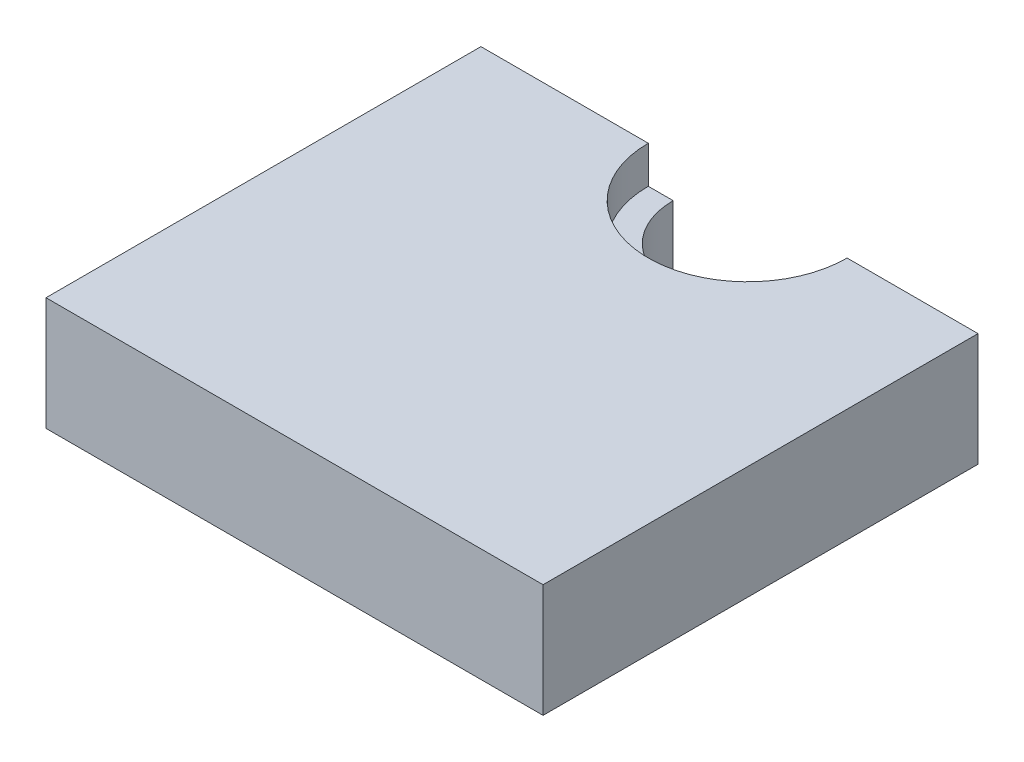
ISO-10303-21;
HEADER;
FILE_DESCRIPTION(('STEP AP214'),'2;1');
FILE_NAME('part.step','',(''),(''),'','','');
FILE_SCHEMA(('AUTOMOTIVE_DESIGN { 1 0 10303 214 1 1 1 1 }'));
ENDSEC;
DATA;
#1=APPLICATION_CONTEXT('core data for automotive mechanical design processes');
#2=APPLICATION_PROTOCOL_DEFINITION('international standard','automotive_design',2000,#1);
#3=PRODUCT_CONTEXT('',#1,'mechanical');
#4=PRODUCT('Part','Part','',(#3));
#5=PRODUCT_RELATED_PRODUCT_CATEGORY('part','',(#4));
#6=PRODUCT_DEFINITION_FORMATION('','',#4);
#7=PRODUCT_DEFINITION_CONTEXT('part definition',#1,'design');
#8=PRODUCT_DEFINITION('design','',#6,#7);
#9=PRODUCT_DEFINITION_SHAPE('','',#8);
#10=(LENGTH_UNIT() NAMED_UNIT(*) SI_UNIT(.MILLI.,.METRE.));
#11=(NAMED_UNIT(*) PLANE_ANGLE_UNIT() SI_UNIT($,.RADIAN.));
#12=(NAMED_UNIT(*) SI_UNIT($,.STERADIAN.) SOLID_ANGLE_UNIT());
#13=UNCERTAINTY_MEASURE_WITH_UNIT(LENGTH_MEASURE(1.E-05),#10,'distance_accuracy_value','');
#14=(GEOMETRIC_REPRESENTATION_CONTEXT(3) GLOBAL_UNCERTAINTY_ASSIGNED_CONTEXT((#13)) GLOBAL_UNIT_ASSIGNED_CONTEXT((#10,
#11,#12)) REPRESENTATION_CONTEXT('',''));
#15=CARTESIAN_POINT('',(0.,0.,0.));
#16=DIRECTION('',(0.,0.,1.));
#17=DIRECTION('',(1.,0.,0.));
#18=AXIS2_PLACEMENT_3D('',#15,#16,#17);
#19=CARTESIAN_POINT('',(0.,0.,0.));
#20=DIRECTION('',(0.,0.,-1.));
#21=DIRECTION('',(-1.,0.,0.));
#22=AXIS2_PLACEMENT_3D('',#19,#20,#21);
#23=PLANE('',#22);
#24=DIRECTION('',(0.,-1.,0.));
#25=VECTOR('',#24,1.);
#26=CARTESIAN_POINT('',(9.46778918948752,-9.28940992353105,0.));
#27=LINE('',#26,#25);
#28=CARTESIAN_POINT('',(9.46778918948752,-3.99999999999999,0.));
#29=VERTEX_POINT('',#28);
#30=CARTESIAN_POINT('',(9.46778918948752,-4.10806391469265,0.));
#31=VERTEX_POINT('',#30);
#32=EDGE_CURVE('E140',#29,#31,#27,.T.);
#33=ORIENTED_EDGE('',*,*,#32,.F.);
#34=DIRECTION('',(1.,0.,0.));
#35=VECTOR('',#34,1.);
#36=CARTESIAN_POINT('',(0.,-3.99999999999999,0.));
#37=LINE('',#36,#35);
#38=CARTESIAN_POINT('',(7.46778918948752,-3.99999999999999,0.));
#39=VERTEX_POINT('',#38);
#40=EDGE_CURVE('E151',#39,#29,#37,.T.);
#41=ORIENTED_EDGE('',*,*,#40,.F.);
#42=DIRECTION('',(0.,-1.,0.));
#43=VECTOR('',#42,1.);
#44=CARTESIAN_POINT('',(7.46778918948752,-9.28940992353105,0.));
#45=LINE('',#44,#43);
#46=CARTESIAN_POINT('',(7.46778918948752,2.00000000000001,0.));
#47=VERTEX_POINT('',#46);
#48=EDGE_CURVE('E150',#47,#39,#45,.T.);
#49=ORIENTED_EDGE('',*,*,#48,.F.);
#50=DIRECTION('',(-1.,0.,0.));
#51=VECTOR('',#50,1.);
#52=CARTESIAN_POINT('',(0.,2.00000000000001,0.));
#53=LINE('',#52,#51);
#54=CARTESIAN_POINT('',(9.46778918948752,2.00000000000001,0.));
#55=VERTEX_POINT('',#54);
#56=EDGE_CURVE('E160',#55,#47,#53,.T.);
#57=ORIENTED_EDGE('',*,*,#56,.F.);
#58=DIRECTION('',(0.,-1.,0.));
#59=VECTOR('',#58,1.);
#60=CARTESIAN_POINT('',(9.46778918948753,-9.28940992353105,0.));
#61=LINE('',#60,#59);
#62=CARTESIAN_POINT('',(9.46778918948752,5.00000000000001,0.));
#63=VERTEX_POINT('',#62);
#64=EDGE_CURVE('E162',#63,#55,#61,.T.);
#65=ORIENTED_EDGE('',*,*,#64,.F.);
#66=DIRECTION('',(-1.,0.,0.));
#67=VECTOR('',#66,1.);
#68=CARTESIAN_POINT('',(-20.,5.,0.));
#69=LINE('',#68,#67);
#70=CARTESIAN_POINT('',(20.,5.,0.));
#71=VERTEX_POINT('',#70);
#72=EDGE_CURVE('E39',#71,#63,#69,.T.);
#73=ORIENTED_EDGE('',*,*,#72,.F.);
#74=DIRECTION('',(0.,1.,0.));
#75=VECTOR('',#74,1.);
#76=CARTESIAN_POINT('',(20.,-4.10806391469265,0.));
#77=LINE('',#76,#75);
#78=CARTESIAN_POINT('',(20.,-4.10806391469265,0.));
#79=VERTEX_POINT('',#78);
#80=EDGE_CURVE('E128',#79,#71,#77,.T.);
#81=ORIENTED_EDGE('',*,*,#80,.F.);
#82=DIRECTION('',(1.,0.,0.));
#83=VECTOR('',#82,1.);
#84=CARTESIAN_POINT('',(-20.,-4.10806391469265,0.));
#85=LINE('',#84,#83);
#86=EDGE_CURVE('E111',#31,#79,#85,.T.);
#87=ORIENTED_EDGE('',*,*,#86,.F.);
#88=EDGE_LOOP('',(#33,#41,#49,#57,#65,#73,#81,#87));
#89=FACE_BOUND('',#88,.T.);
#90=ADVANCED_FACE('F35',(#89),#23,.T.);
#91=DIRECTION('',(0.,-1.,0.));
#92=VECTOR('',#91,1.);
#93=CARTESIAN_POINT('',(-6.53221081051248,-9.28940992353105,0.));
#94=LINE('',#93,#92);
#95=CARTESIAN_POINT('',(-6.53221081051248,-4.10806391469265,0.));
#96=VERTEX_POINT('',#95);
#97=CARTESIAN_POINT('',(-6.53221081051248,-3.99999999999999,0.));
#98=VERTEX_POINT('',#97);
#99=EDGE_CURVE('E182',#96,#98,#94,.F.);
#100=ORIENTED_EDGE('',*,*,#99,.F.);
#101=CARTESIAN_POINT('',(-20.,-4.10806391469265,0.));
#102=VERTEX_POINT('',#101);
#103=EDGE_CURVE('E123',#102,#96,#85,.T.);
#104=ORIENTED_EDGE('',*,*,#103,.F.);
#105=DIRECTION('',(0.,-1.,0.));
#106=VECTOR('',#105,1.);
#107=CARTESIAN_POINT('',(-20.,-4.10806391469265,0.));
#108=LINE('',#107,#106);
#109=CARTESIAN_POINT('',(-20.,5.,0.));
#110=VERTEX_POINT('',#109);
#111=EDGE_CURVE('E137',#110,#102,#108,.T.);
#112=ORIENTED_EDGE('',*,*,#111,.F.);
#113=CARTESIAN_POINT('',(-6.53221081051248,5.00000000000001,0.));
#114=VERTEX_POINT('',#113);
#115=EDGE_CURVE('E163',#114,#110,#69,.T.);
#116=ORIENTED_EDGE('',*,*,#115,.F.);
#117=DIRECTION('',(0.,-1.,0.));
#118=VECTOR('',#117,1.);
#119=CARTESIAN_POINT('',(-6.53221081051248,-9.28940992353105,0.));
#120=LINE('',#119,#118);
#121=CARTESIAN_POINT('',(-6.53221081051248,2.00000000000001,0.));
#122=VERTEX_POINT('',#121);
#123=EDGE_CURVE('E11',#122,#114,#120,.F.);
#124=ORIENTED_EDGE('',*,*,#123,.F.);
#125=CARTESIAN_POINT('',(-4.53221081051248,2.00000000000001,0.));
#126=VERTEX_POINT('',#125);
#127=EDGE_CURVE('E159',#126,#122,#53,.T.);
#128=ORIENTED_EDGE('',*,*,#127,.F.);
#129=DIRECTION('',(0.,-1.,0.));
#130=VECTOR('',#129,1.);
#131=CARTESIAN_POINT('',(-4.53221081051248,-9.28940992353105,0.));
#132=LINE('',#131,#130);
#133=CARTESIAN_POINT('',(-4.53221081051248,-3.99999999999999,0.));
#134=VERTEX_POINT('',#133);
#135=EDGE_CURVE('E155',#134,#126,#132,.F.);
#136=ORIENTED_EDGE('',*,*,#135,.F.);
#137=EDGE_CURVE('E184',#98,#134,#37,.T.);
#138=ORIENTED_EDGE('',*,*,#137,.F.);
#139=EDGE_LOOP('',(#100,#104,#112,#116,#124,#128,#136,#138));
#140=FACE_BOUND('',#139,.T.);
#141=ADVANCED_FACE('F179',(#140),#23,.T.);
#142=CARTESIAN_POINT('',(20.,-4.10806391469265,35.));
#143=DIRECTION('',(-1.,0.,0.));
#144=DIRECTION('',(0.,-1.,0.));
#145=AXIS2_PLACEMENT_3D('',#142,#143,#144);
#146=PLANE('',#145);
#147=ORIENTED_EDGE('',*,*,#80,.T.);
#148=DIRECTION('',(0.,0.,-1.));
#149=VECTOR('',#148,1.);
#150=CARTESIAN_POINT('',(20.,5.,35.));
#151=LINE('',#150,#149);
#152=CARTESIAN_POINT('',(20.,5.,35.));
#153=VERTEX_POINT('',#152);
#154=EDGE_CURVE('E173',#153,#71,#151,.T.);
#155=ORIENTED_EDGE('',*,*,#154,.F.);
#156=DIRECTION('',(0.,1.,0.));
#157=VECTOR('',#156,1.);
#158=CARTESIAN_POINT('',(20.,-4.10806391469265,35.));
#159=LINE('',#158,#157);
#160=CARTESIAN_POINT('',(20.,-4.10806391469265,35.));
#161=VERTEX_POINT('',#160);
#162=EDGE_CURVE('E130',#161,#153,#159,.T.);
#163=ORIENTED_EDGE('',*,*,#162,.F.);
#164=DIRECTION('',(0.,0.,-1.));
#165=VECTOR('',#164,1.);
#166=CARTESIAN_POINT('',(20.,-4.10806391469265,35.));
#167=LINE('',#166,#165);
#168=EDGE_CURVE('E116',#161,#79,#167,.T.);
#169=ORIENTED_EDGE('',*,*,#168,.T.);
#170=EDGE_LOOP('',(#147,#155,#163,#169));
#171=FACE_BOUND('',#170,.T.);
#172=ADVANCED_FACE('F126',(#171),#146,.F.);
#173=CARTESIAN_POINT('',(-20.,5.,35.));
#174=DIRECTION('',(0.,-1.,0.));
#175=DIRECTION('',(0.,0.,-1.));
#176=AXIS2_PLACEMENT_3D('',#173,#174,#175);
#177=PLANE('',#176);
#178=ORIENTED_EDGE('',*,*,#72,.T.);
#179=CARTESIAN_POINT('',(1.46778918948752,5.00000000000001,0.));
#180=DIRECTION('',(0.,-1.,0.));
#181=DIRECTION('',(-0.837169104331222,0.,-0.546944138603989));
#182=AXIS2_PLACEMENT_3D('',#179,#180,#181);
#183=CIRCLE('',#182,8.);
#184=EDGE_CURVE('E51',#63,#114,#183,.T.);
#185=ORIENTED_EDGE('',*,*,#184,.T.);
#186=ORIENTED_EDGE('',*,*,#115,.T.);
#187=DIRECTION('',(0.,0.,-1.));
#188=VECTOR('',#187,1.);
#189=CARTESIAN_POINT('',(-20.,5.,35.));
#190=LINE('',#189,#188);
#191=CARTESIAN_POINT('',(-20.,5.,35.));
#192=VERTEX_POINT('',#191);
#193=EDGE_CURVE('E164',#192,#110,#190,.T.);
#194=ORIENTED_EDGE('',*,*,#193,.F.);
#195=DIRECTION('',(-1.,0.,0.));
#196=VECTOR('',#195,1.);
#197=CARTESIAN_POINT('',(-20.,5.,35.));
#198=LINE('',#197,#196);
#199=EDGE_CURVE('E143',#153,#192,#198,.T.);
#200=ORIENTED_EDGE('',*,*,#199,.F.);
#201=ORIENTED_EDGE('',*,*,#154,.T.);
#202=EDGE_LOOP('',(#178,#185,#186,#194,#200,#201));
#203=FACE_BOUND('',#202,.T.);
#204=ADVANCED_FACE('F37',(#203),#177,.F.);
#205=CARTESIAN_POINT('',(-20.,-4.10806391469265,35.));
#206=DIRECTION('',(1.,0.,0.));
#207=DIRECTION('',(0.,0.,-1.));
#208=AXIS2_PLACEMENT_3D('',#205,#206,#207);
#209=PLANE('',#208);
#210=ORIENTED_EDGE('',*,*,#111,.T.);
#211=DIRECTION('',(0.,0.,-1.));
#212=VECTOR('',#211,1.);
#213=CARTESIAN_POINT('',(-20.,-4.10806391469265,35.));
#214=LINE('',#213,#212);
#215=CARTESIAN_POINT('',(-20.,-4.10806391469265,35.));
#216=VERTEX_POINT('',#215);
#217=EDGE_CURVE('E122',#216,#102,#214,.T.);
#218=ORIENTED_EDGE('',*,*,#217,.F.);
#219=DIRECTION('',(0.,-1.,0.));
#220=VECTOR('',#219,1.);
#221=CARTESIAN_POINT('',(-20.,-4.10806391469265,35.));
#222=LINE('',#221,#220);
#223=EDGE_CURVE('E141',#192,#216,#222,.T.);
#224=ORIENTED_EDGE('',*,*,#223,.F.);
#225=ORIENTED_EDGE('',*,*,#193,.T.);
#226=EDGE_LOOP('',(#210,#218,#224,#225));
#227=FACE_BOUND('',#226,.T.);
#228=ADVANCED_FACE('F228',(#227),#209,.F.);
#229=CARTESIAN_POINT('',(-20.,-4.10806391469265,35.));
#230=DIRECTION('',(0.,1.,0.));
#231=DIRECTION('',(0.,0.,1.));
#232=AXIS2_PLACEMENT_3D('',#229,#230,#231);
#233=PLANE('',#232);
#234=ORIENTED_EDGE('',*,*,#103,.T.);
#235=CARTESIAN_POINT('',(1.46778918948752,-4.10806391469265,0.));
#236=DIRECTION('',(0.,1.,0.));
#237=DIRECTION('',(0.,0.,1.));
#238=AXIS2_PLACEMENT_3D('',#235,#236,#237);
#239=CIRCLE('',#238,8.);
#240=EDGE_CURVE('E118',#96,#31,#239,.T.);
#241=ORIENTED_EDGE('',*,*,#240,.T.);
#242=ORIENTED_EDGE('',*,*,#86,.T.);
#243=ORIENTED_EDGE('',*,*,#168,.F.);
#244=DIRECTION('',(1.,0.,0.));
#245=VECTOR('',#244,1.);
#246=CARTESIAN_POINT('',(-20.,-4.10806391469265,35.));
#247=LINE('',#246,#245);
#248=EDGE_CURVE('E138',#216,#161,#247,.T.);
#249=ORIENTED_EDGE('',*,*,#248,.F.);
#250=ORIENTED_EDGE('',*,*,#217,.T.);
#251=EDGE_LOOP('',(#234,#241,#242,#243,#249,#250));
#252=FACE_BOUND('',#251,.T.);
#253=ADVANCED_FACE('F114',(#252),#233,.F.);
#254=CARTESIAN_POINT('',(0.,0.,35.));
#255=DIRECTION('',(0.,0.,-1.));
#256=DIRECTION('',(-1.,0.,0.));
#257=AXIS2_PLACEMENT_3D('',#254,#255,#256);
#258=PLANE('',#257);
#259=ORIENTED_EDGE('',*,*,#162,.T.);
#260=ORIENTED_EDGE('',*,*,#199,.T.);
#261=ORIENTED_EDGE('',*,*,#223,.T.);
#262=ORIENTED_EDGE('',*,*,#248,.T.);
#263=EDGE_LOOP('',(#259,#260,#261,#262));
#264=FACE_BOUND('',#263,.T.);
#265=ADVANCED_FACE('F210',(#264),#258,.F.);
#266=CARTESIAN_POINT('',(1.46778918948752,-9.28940992353105,0.));
#267=DIRECTION('',(0.,-1.,0.));
#268=DIRECTION('',(-0.837169104331222,0.,-0.546944138603989));
#269=AXIS2_PLACEMENT_3D('',#266,#267,#268);
#270=CYLINDRICAL_SURFACE('',#269,8.);
#271=ORIENTED_EDGE('',*,*,#32,.T.);
#272=ORIENTED_EDGE('',*,*,#240,.F.);
#273=ORIENTED_EDGE('',*,*,#99,.T.);
#274=CARTESIAN_POINT('',(1.46778918948752,-3.99999999999999,0.));
#275=DIRECTION('',(0.,-1.,0.));
#276=DIRECTION('',(-0.837169104331222,0.,-0.546944138603989));
#277=AXIS2_PLACEMENT_3D('',#274,#275,#276);
#278=CIRCLE('',#277,8.);
#279=EDGE_CURVE('E147',#29,#98,#278,.T.);
#280=ORIENTED_EDGE('',*,*,#279,.F.);
#281=EDGE_LOOP('',(#271,#272,#273,#280));
#282=FACE_BOUND('',#281,.T.);
#283=ADVANCED_FACE('F208',(#282),#270,.F.);
#284=CARTESIAN_POINT('',(5.84334229831943,-3.99999999999999,-6.69735283464979));
#285=DIRECTION('',(0.,1.,0.));
#286=DIRECTION('',(0.837169104331222,0.,0.546944138603989));
#287=AXIS2_PLACEMENT_3D('',#284,#285,#286);
#288=PLANE('',#287);
#289=ORIENTED_EDGE('',*,*,#137,.T.);
#290=CARTESIAN_POINT('',(1.46778918948752,-3.99999999999999,0.));
#291=DIRECTION('',(0.,-1.,0.));
#292=DIRECTION('',(-0.837169104331222,0.,-0.546944138603989));
#293=AXIS2_PLACEMENT_3D('',#290,#291,#292);
#294=CIRCLE('',#293,6.);
#295=EDGE_CURVE('E152',#39,#134,#294,.T.);
#296=ORIENTED_EDGE('',*,*,#295,.F.);
#297=ORIENTED_EDGE('',*,*,#40,.T.);
#298=ORIENTED_EDGE('',*,*,#279,.T.);
#299=EDGE_LOOP('',(#289,#296,#297,#298));
#300=FACE_BOUND('',#299,.T.);
#301=ADVANCED_FACE('F207',(#300),#288,.F.);
#302=CARTESIAN_POINT('',(1.46778918948752,-9.28940992353105,0.));
#303=DIRECTION('',(0.,-1.,0.));
#304=DIRECTION('',(-0.837169104331222,0.,-0.546944138603989));
#305=AXIS2_PLACEMENT_3D('',#302,#303,#304);
#306=CYLINDRICAL_SURFACE('',#305,6.);
#307=ORIENTED_EDGE('',*,*,#48,.T.);
#308=ORIENTED_EDGE('',*,*,#295,.T.);
#309=ORIENTED_EDGE('',*,*,#135,.T.);
#310=CARTESIAN_POINT('',(1.46778918948752,2.00000000000001,0.));
#311=DIRECTION('',(0.,-1.,0.));
#312=DIRECTION('',(-0.837169104331222,0.,-0.546944138603989));
#313=AXIS2_PLACEMENT_3D('',#310,#311,#312);
#314=CIRCLE('',#313,6.);
#315=EDGE_CURVE('E156',#47,#126,#314,.T.);
#316=ORIENTED_EDGE('',*,*,#315,.F.);
#317=EDGE_LOOP('',(#307,#308,#309,#316));
#318=FACE_BOUND('',#317,.T.);
#319=ADVANCED_FACE('F203',(#318),#306,.F.);
#320=CARTESIAN_POINT('',(4.74945402111145,2.00000000000001,-5.02301462598734));
#321=DIRECTION('',(0.,-1.,0.));
#322=DIRECTION('',(-0.837169104331222,0.,-0.546944138603989));
#323=AXIS2_PLACEMENT_3D('',#320,#321,#322);
#324=PLANE('',#323);
#325=ORIENTED_EDGE('',*,*,#56,.T.);
#326=ORIENTED_EDGE('',*,*,#315,.T.);
#327=ORIENTED_EDGE('',*,*,#127,.T.);
#328=CARTESIAN_POINT('',(1.46778918948752,2.00000000000001,0.));
#329=DIRECTION('',(0.,-1.,0.));
#330=DIRECTION('',(-0.837169104331222,0.,-0.546944138603989));
#331=AXIS2_PLACEMENT_3D('',#328,#329,#330);
#332=CIRCLE('',#331,8.);
#333=EDGE_CURVE('E44',#55,#122,#332,.T.);
#334=ORIENTED_EDGE('',*,*,#333,.F.);
#335=EDGE_LOOP('',(#325,#326,#327,#334));
#336=FACE_BOUND('',#335,.T.);
#337=ADVANCED_FACE('F200',(#336),#324,.F.);
#338=CARTESIAN_POINT('',(1.46778918948752,-9.28940992353105,0.));
#339=DIRECTION('',(0.,-1.,0.));
#340=DIRECTION('',(-0.837169104331222,0.,-0.546944138603989));
#341=AXIS2_PLACEMENT_3D('',#338,#339,#340);
#342=CYLINDRICAL_SURFACE('',#341,8.);
#343=ORIENTED_EDGE('',*,*,#64,.T.);
#344=ORIENTED_EDGE('',*,*,#333,.T.);
#345=ORIENTED_EDGE('',*,*,#123,.T.);
#346=ORIENTED_EDGE('',*,*,#184,.F.);
#347=EDGE_LOOP('',(#343,#344,#345,#346));
#348=FACE_BOUND('',#347,.T.);
#349=ADVANCED_FACE('F225',(#348),#342,.F.);
#350=CLOSED_SHELL('',(#90,#141,#172,#204,#228,#253,#265,#283,#301,#319,#337,#349));
#351=MANIFOLD_SOLID_BREP('B2',#350);
#352=ADVANCED_BREP_SHAPE_REPRESENTATION('',(#18,#351),#14);
#353=SHAPE_DEFINITION_REPRESENTATION(#9,#352);
ENDSEC;
END-ISO-10303-21;
